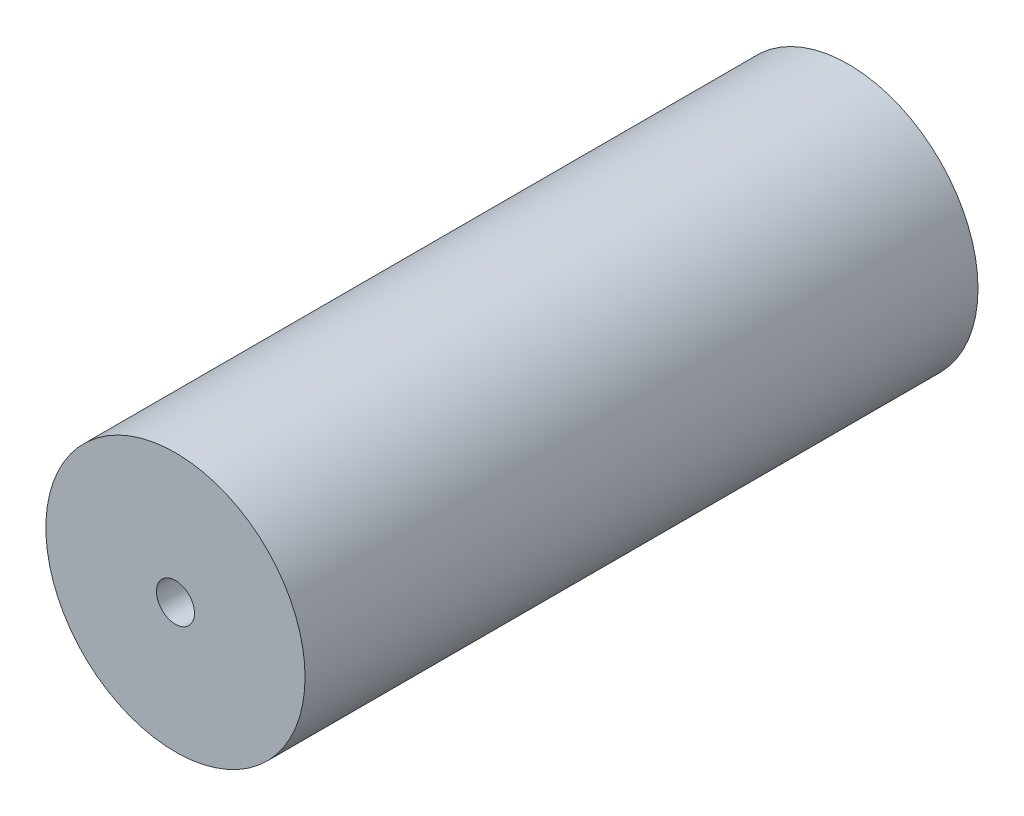
ISO-10303-21;
HEADER;
FILE_DESCRIPTION(('STEP AP214'),'2;1');
FILE_NAME('part.step','',(''),(''),'','','');
FILE_SCHEMA(('AUTOMOTIVE_DESIGN { 1 0 10303 214 1 1 1 1 }'));
ENDSEC;
DATA;
#1=APPLICATION_CONTEXT('core data for automotive mechanical design processes');
#2=APPLICATION_PROTOCOL_DEFINITION('international standard','automotive_design',2000,#1);
#3=PRODUCT_CONTEXT('',#1,'mechanical');
#4=PRODUCT('Part','Part','',(#3));
#5=PRODUCT_RELATED_PRODUCT_CATEGORY('part','',(#4));
#6=PRODUCT_DEFINITION_FORMATION('','',#4);
#7=PRODUCT_DEFINITION_CONTEXT('part definition',#1,'design');
#8=PRODUCT_DEFINITION('design','',#6,#7);
#9=PRODUCT_DEFINITION_SHAPE('','',#8);
#10=(LENGTH_UNIT() NAMED_UNIT(*) SI_UNIT(.MILLI.,.METRE.));
#11=(NAMED_UNIT(*) PLANE_ANGLE_UNIT() SI_UNIT($,.RADIAN.));
#12=(NAMED_UNIT(*) SI_UNIT($,.STERADIAN.) SOLID_ANGLE_UNIT());
#13=UNCERTAINTY_MEASURE_WITH_UNIT(LENGTH_MEASURE(1.E-05),#10,'distance_accuracy_value','');
#14=(GEOMETRIC_REPRESENTATION_CONTEXT(3) GLOBAL_UNCERTAINTY_ASSIGNED_CONTEXT((#13)) GLOBAL_UNIT_ASSIGNED_CONTEXT((#10,
#11,#12)) REPRESENTATION_CONTEXT('',''));
#15=CARTESIAN_POINT('',(0.,0.,0.));
#16=DIRECTION('',(0.,0.,1.));
#17=DIRECTION('',(1.,0.,0.));
#18=AXIS2_PLACEMENT_3D('',#15,#16,#17);
#19=CARTESIAN_POINT('',(0.,0.,135.));
#20=DIRECTION('',(0.,0.,-1.));
#21=DIRECTION('',(-1.,0.,0.));
#22=AXIS2_PLACEMENT_3D('',#19,#20,#21);
#23=CYLINDRICAL_SURFACE('',#22,3.815);
#24=CARTESIAN_POINT('',(0.,0.,135.));
#25=DIRECTION('',(0.,0.,-1.));
#26=DIRECTION('',(-1.,0.,0.));
#27=AXIS2_PLACEMENT_3D('',#24,#25,#26);
#28=CIRCLE('',#27,3.815);
#29=CARTESIAN_POINT('',(-3.815,0.,135.));
#30=VERTEX_POINT('',#29);
#31=EDGE_CURVE('E44',#30,#30,#28,.T.);
#32=ORIENTED_EDGE('',*,*,#31,.F.);
#33=EDGE_LOOP('',(#32));
#34=FACE_BOUND('',#33,.T.);
#35=CARTESIAN_POINT('',(0.,0.,30.));
#36=DIRECTION('',(0.,0.,-1.));
#37=DIRECTION('',(-1.,0.,0.));
#38=AXIS2_PLACEMENT_3D('',#35,#36,#37);
#39=CIRCLE('',#38,3.815);
#40=CARTESIAN_POINT('',(-3.815,0.,30.));
#41=VERTEX_POINT('',#40);
#42=EDGE_CURVE('E35',#41,#41,#39,.F.);
#43=ORIENTED_EDGE('',*,*,#42,.F.);
#44=EDGE_LOOP('',(#43));
#45=FACE_BOUND('',#44,.T.);
#46=ADVANCED_FACE('F31',(#34,#45),#23,.F.);
#47=CARTESIAN_POINT('',(0.,0.,135.));
#48=DIRECTION('',(0.,0.,-1.));
#49=DIRECTION('',(-1.,0.,0.));
#50=AXIS2_PLACEMENT_3D('',#47,#48,#49);
#51=CYLINDRICAL_SURFACE('',#50,26.);
#52=CARTESIAN_POINT('',(0.,0.,135.));
#53=DIRECTION('',(0.,0.,1.));
#54=DIRECTION('',(1.,0.,0.));
#55=AXIS2_PLACEMENT_3D('',#52,#53,#54);
#56=CIRCLE('',#55,26.);
#57=CARTESIAN_POINT('',(26.,0.,135.));
#58=VERTEX_POINT('',#57);
#59=EDGE_CURVE('E10',#58,#58,#56,.T.);
#60=ORIENTED_EDGE('',*,*,#59,.F.);
#61=EDGE_LOOP('',(#60));
#62=FACE_BOUND('',#61,.T.);
#63=CARTESIAN_POINT('',(0.,0.,0.));
#64=DIRECTION('',(0.,0.,1.));
#65=DIRECTION('',(1.,0.,0.));
#66=AXIS2_PLACEMENT_3D('',#63,#64,#65);
#67=CIRCLE('',#66,26.);
#68=CARTESIAN_POINT('',(26.,0.,0.));
#69=VERTEX_POINT('',#68);
#70=EDGE_CURVE('E39',#69,#69,#67,.T.);
#71=ORIENTED_EDGE('',*,*,#70,.T.);
#72=EDGE_LOOP('',(#71));
#73=FACE_BOUND('',#72,.T.);
#74=ADVANCED_FACE('F33',(#62,#73),#51,.T.);
#75=CARTESIAN_POINT('',(0.,0.,135.));
#76=DIRECTION('',(0.,0.,1.));
#77=DIRECTION('',(1.,0.,0.));
#78=AXIS2_PLACEMENT_3D('',#75,#76,#77);
#79=PLANE('',#78);
#80=ORIENTED_EDGE('',*,*,#31,.T.);
#81=EDGE_LOOP('',(#80));
#82=FACE_BOUND('',#81,.T.);
#83=ORIENTED_EDGE('',*,*,#59,.T.);
#84=EDGE_LOOP('',(#83));
#85=FACE_BOUND('',#84,.T.);
#86=ADVANCED_FACE('F66',(#82,#85),#79,.T.);
#87=CARTESIAN_POINT('',(0.,0.,0.));
#88=DIRECTION('',(0.,0.,1.));
#89=DIRECTION('',(1.,0.,0.));
#90=AXIS2_PLACEMENT_3D('',#87,#88,#89);
#91=PLANE('',#90);
#92=CARTESIAN_POINT('',(0.,0.,0.));
#93=DIRECTION('',(0.,0.,-1.));
#94=DIRECTION('',(-1.,0.,0.));
#95=AXIS2_PLACEMENT_3D('',#92,#93,#94);
#96=CIRCLE('',#95,18.5);
#97=CARTESIAN_POINT('',(-18.5,0.,0.));
#98=VERTEX_POINT('',#97);
#99=EDGE_CURVE('E48',#98,#98,#96,.T.);
#100=ORIENTED_EDGE('',*,*,#99,.F.);
#101=EDGE_LOOP('',(#100));
#102=FACE_BOUND('',#101,.T.);
#103=ORIENTED_EDGE('',*,*,#70,.F.);
#104=EDGE_LOOP('',(#103));
#105=FACE_BOUND('',#104,.T.);
#106=ADVANCED_FACE('F74',(#102,#105),#91,.F.);
#107=CARTESIAN_POINT('',(0.,0.,30.));
#108=DIRECTION('',(0.,0.,-1.));
#109=DIRECTION('',(-1.,0.,0.));
#110=AXIS2_PLACEMENT_3D('',#107,#108,#109);
#111=PLANE('',#110);
#112=CARTESIAN_POINT('',(0.,0.,30.));
#113=DIRECTION('',(0.,0.,-1.));
#114=DIRECTION('',(-1.,0.,0.));
#115=AXIS2_PLACEMENT_3D('',#112,#113,#114);
#116=CIRCLE('',#115,18.5);
#117=CARTESIAN_POINT('',(-18.5,0.,30.));
#118=VERTEX_POINT('',#117);
#119=EDGE_CURVE('E51',#118,#118,#116,.T.);
#120=ORIENTED_EDGE('',*,*,#119,.T.);
#121=EDGE_LOOP('',(#120));
#122=FACE_BOUND('',#121,.T.);
#123=ORIENTED_EDGE('',*,*,#42,.T.);
#124=EDGE_LOOP('',(#123));
#125=FACE_BOUND('',#124,.T.);
#126=ADVANCED_FACE('F58',(#122,#125),#111,.T.);
#127=CARTESIAN_POINT('',(0.,0.,30.));
#128=DIRECTION('',(0.,0.,-1.));
#129=DIRECTION('',(-1.,0.,0.));
#130=AXIS2_PLACEMENT_3D('',#127,#128,#129);
#131=CYLINDRICAL_SURFACE('',#130,18.5);
#132=ORIENTED_EDGE('',*,*,#119,.F.);
#133=EDGE_LOOP('',(#132));
#134=FACE_BOUND('',#133,.T.);
#135=ORIENTED_EDGE('',*,*,#99,.T.);
#136=EDGE_LOOP('',(#135));
#137=FACE_BOUND('',#136,.T.);
#138=ADVANCED_FACE('F71',(#134,#137),#131,.F.);
#139=CLOSED_SHELL('',(#46,#74,#86,#106,#126,#138));
#140=MANIFOLD_SOLID_BREP('B2',#139);
#141=ADVANCED_BREP_SHAPE_REPRESENTATION('',(#18,#140),#14);
#142=SHAPE_DEFINITION_REPRESENTATION(#9,#141);
ENDSEC;
END-ISO-10303-21;
